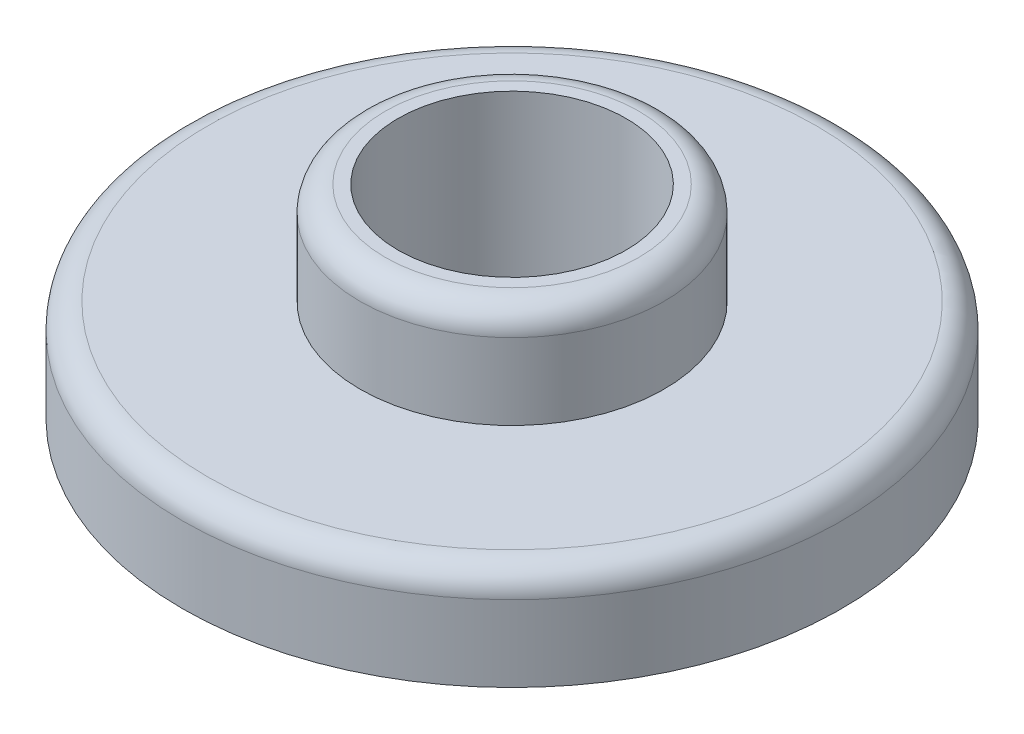
ISO-10303-21;
HEADER;
FILE_DESCRIPTION(('STEP AP214'),'2;1');
FILE_NAME('part.step','',(''),(''),'','','');
FILE_SCHEMA(('AUTOMOTIVE_DESIGN { 1 0 10303 214 1 1 1 1 }'));
ENDSEC;
DATA;
#1=APPLICATION_CONTEXT('core data for automotive mechanical design processes');
#2=APPLICATION_PROTOCOL_DEFINITION('international standard','automotive_design',2000,#1);
#3=PRODUCT_CONTEXT('',#1,'mechanical');
#4=PRODUCT('Part','Part','',(#3));
#5=PRODUCT_RELATED_PRODUCT_CATEGORY('part','',(#4));
#6=PRODUCT_DEFINITION_FORMATION('','',#4);
#7=PRODUCT_DEFINITION_CONTEXT('part definition',#1,'design');
#8=PRODUCT_DEFINITION('design','',#6,#7);
#9=PRODUCT_DEFINITION_SHAPE('','',#8);
#10=(LENGTH_UNIT() NAMED_UNIT(*) SI_UNIT(.MILLI.,.METRE.));
#11=(NAMED_UNIT(*) PLANE_ANGLE_UNIT() SI_UNIT($,.RADIAN.));
#12=(NAMED_UNIT(*) SI_UNIT($,.STERADIAN.) SOLID_ANGLE_UNIT());
#13=UNCERTAINTY_MEASURE_WITH_UNIT(LENGTH_MEASURE(1.E-05),#10,'distance_accuracy_value','');
#14=(GEOMETRIC_REPRESENTATION_CONTEXT(3) GLOBAL_UNCERTAINTY_ASSIGNED_CONTEXT((#13)) GLOBAL_UNIT_ASSIGNED_CONTEXT((#10,
#11,#12)) REPRESENTATION_CONTEXT('',''));
#15=CARTESIAN_POINT('',(0.,0.,0.));
#16=DIRECTION('',(0.,0.,1.));
#17=DIRECTION('',(1.,0.,0.));
#18=AXIS2_PLACEMENT_3D('',#15,#16,#17);
#19=CARTESIAN_POINT('',(0.,2.,0.));
#20=DIRECTION('',(0.,-1.,0.));
#21=DIRECTION('',(0.,0.,-1.));
#22=AXIS2_PLACEMENT_3D('',#19,#20,#21);
#23=CYLINDRICAL_SURFACE('',#22,6.5);
#24=CARTESIAN_POINT('',(0.,1.5,0.));
#25=DIRECTION('',(0.,1.,0.));
#26=DIRECTION('',(0.,0.,1.));
#27=AXIS2_PLACEMENT_3D('',#24,#25,#26);
#28=CIRCLE('',#27,6.5);
#29=CARTESIAN_POINT('',(0.,1.5,6.5));
#30=VERTEX_POINT('',#29);
#31=EDGE_CURVE('E10',#30,#30,#28,.F.);
#32=ORIENTED_EDGE('',*,*,#31,.T.);
#33=EDGE_LOOP('',(#32));
#34=FACE_BOUND('',#33,.T.);
#35=CARTESIAN_POINT('',(0.,0.,0.));
#36=DIRECTION('',(0.,1.,0.));
#37=DIRECTION('',(0.,0.,1.));
#38=AXIS2_PLACEMENT_3D('',#35,#36,#37);
#39=CIRCLE('',#38,6.5);
#40=CARTESIAN_POINT('',(0.,0.,6.5));
#41=VERTEX_POINT('',#40);
#42=EDGE_CURVE('E68',#41,#41,#39,.T.);
#43=ORIENTED_EDGE('',*,*,#42,.T.);
#44=EDGE_LOOP('',(#43));
#45=FACE_BOUND('',#44,.T.);
#46=ADVANCED_FACE('F43',(#34,#45),#23,.T.);
#47=CARTESIAN_POINT('',(0.,2.,0.));
#48=DIRECTION('',(0.,1.,0.));
#49=DIRECTION('',(0.,0.,1.));
#50=AXIS2_PLACEMENT_3D('',#47,#48,#49);
#51=PLANE('',#50);
#52=CARTESIAN_POINT('',(0.,2.,0.));
#53=DIRECTION('',(0.,1.,0.));
#54=DIRECTION('',(0.,0.,1.));
#55=AXIS2_PLACEMENT_3D('',#52,#53,#54);
#56=CIRCLE('',#55,6.);
#57=CARTESIAN_POINT('',(0.,2.,6.));
#58=VERTEX_POINT('',#57);
#59=EDGE_CURVE('E51',#58,#58,#56,.T.);
#60=ORIENTED_EDGE('',*,*,#59,.T.);
#61=EDGE_LOOP('',(#60));
#62=FACE_BOUND('',#61,.T.);
#63=CARTESIAN_POINT('',(0.,2.,0.));
#64=DIRECTION('',(0.,1.,0.));
#65=DIRECTION('',(0.,0.,1.));
#66=AXIS2_PLACEMENT_3D('',#63,#64,#65);
#67=CIRCLE('',#66,3.);
#68=CARTESIAN_POINT('',(0.,2.,3.));
#69=VERTEX_POINT('',#68);
#70=EDGE_CURVE('E67',#69,#69,#67,.T.);
#71=ORIENTED_EDGE('',*,*,#70,.F.);
#72=EDGE_LOOP('',(#71));
#73=FACE_BOUND('',#72,.T.);
#74=ADVANCED_FACE('F103',(#62,#73),#51,.T.);
#75=CARTESIAN_POINT('',(0.,0.,0.));
#76=DIRECTION('',(0.,1.,0.));
#77=DIRECTION('',(0.,0.,1.));
#78=AXIS2_PLACEMENT_3D('',#75,#76,#77);
#79=PLANE('',#78);
#80=CARTESIAN_POINT('',(0.,0.,0.));
#81=DIRECTION('',(0.,1.,0.));
#82=DIRECTION('',(0.,0.,1.));
#83=AXIS2_PLACEMENT_3D('',#80,#81,#82);
#84=CIRCLE('',#83,2.25);
#85=CARTESIAN_POINT('',(0.,0.,2.25));
#86=VERTEX_POINT('',#85);
#87=EDGE_CURVE('E72',#86,#86,#84,.T.);
#88=ORIENTED_EDGE('',*,*,#87,.T.);
#89=EDGE_LOOP('',(#88));
#90=FACE_BOUND('',#89,.T.);
#91=ORIENTED_EDGE('',*,*,#42,.F.);
#92=EDGE_LOOP('',(#91));
#93=FACE_BOUND('',#92,.T.);
#94=ADVANCED_FACE('F99',(#90,#93),#79,.F.);
#95=CARTESIAN_POINT('',(0.,4.,0.));
#96=DIRECTION('',(0.,-1.,0.));
#97=DIRECTION('',(0.,0.,-1.));
#98=AXIS2_PLACEMENT_3D('',#95,#96,#97);
#99=CYLINDRICAL_SURFACE('',#98,3.);
#100=CARTESIAN_POINT('',(0.,3.5,0.));
#101=DIRECTION('',(0.,1.,0.));
#102=DIRECTION('',(0.,0.,1.));
#103=AXIS2_PLACEMENT_3D('',#100,#101,#102);
#104=CIRCLE('',#103,3.);
#105=CARTESIAN_POINT('',(0.,3.5,3.));
#106=VERTEX_POINT('',#105);
#107=EDGE_CURVE('E56',#106,#106,#104,.F.);
#108=ORIENTED_EDGE('',*,*,#107,.T.);
#109=EDGE_LOOP('',(#108));
#110=FACE_BOUND('',#109,.T.);
#111=ORIENTED_EDGE('',*,*,#70,.T.);
#112=EDGE_LOOP('',(#111));
#113=FACE_BOUND('',#112,.T.);
#114=ADVANCED_FACE('F89',(#110,#113),#99,.T.);
#115=CARTESIAN_POINT('',(0.,4.,0.));
#116=DIRECTION('',(0.,1.,0.));
#117=DIRECTION('',(0.,0.,1.));
#118=AXIS2_PLACEMENT_3D('',#115,#116,#117);
#119=PLANE('',#118);
#120=CARTESIAN_POINT('',(0.,4.,0.));
#121=DIRECTION('',(0.,1.,0.));
#122=DIRECTION('',(0.,0.,1.));
#123=AXIS2_PLACEMENT_3D('',#120,#121,#122);
#124=CIRCLE('',#123,2.5);
#125=CARTESIAN_POINT('',(0.,4.,2.5));
#126=VERTEX_POINT('',#125);
#127=EDGE_CURVE('E61',#126,#126,#124,.T.);
#128=ORIENTED_EDGE('',*,*,#127,.T.);
#129=EDGE_LOOP('',(#128));
#130=FACE_BOUND('',#129,.T.);
#131=CARTESIAN_POINT('',(0.,4.,0.));
#132=DIRECTION('',(0.,1.,0.));
#133=DIRECTION('',(0.,0.,1.));
#134=AXIS2_PLACEMENT_3D('',#131,#132,#133);
#135=CIRCLE('',#134,2.25);
#136=CARTESIAN_POINT('',(0.,4.,2.25));
#137=VERTEX_POINT('',#136);
#138=EDGE_CURVE('E79',#137,#137,#135,.T.);
#139=ORIENTED_EDGE('',*,*,#138,.F.);
#140=EDGE_LOOP('',(#139));
#141=FACE_BOUND('',#140,.T.);
#142=ADVANCED_FACE('F87',(#130,#141),#119,.T.);
#143=CARTESIAN_POINT('',(0.,-6.,0.));
#144=DIRECTION('',(0.,1.,0.));
#145=DIRECTION('',(0.,0.,1.));
#146=AXIS2_PLACEMENT_3D('',#143,#144,#145);
#147=CYLINDRICAL_SURFACE('',#146,2.25);
#148=ORIENTED_EDGE('',*,*,#138,.T.);
#149=EDGE_LOOP('',(#148));
#150=FACE_BOUND('',#149,.T.);
#151=ORIENTED_EDGE('',*,*,#87,.F.);
#152=EDGE_LOOP('',(#151));
#153=FACE_BOUND('',#152,.T.);
#154=ADVANCED_FACE('F84',(#150,#153),#147,.F.);
#155=CARTESIAN_POINT('',(0.,3.5,0.));
#156=DIRECTION('',(0.,1.,0.));
#157=DIRECTION('',(0.,0.,1.));
#158=AXIS2_PLACEMENT_3D('',#155,#156,#157);
#159=TOROIDAL_SURFACE('',#158,2.5,0.5);
#160=ORIENTED_EDGE('',*,*,#107,.F.);
#161=EDGE_LOOP('',(#160));
#162=FACE_BOUND('',#161,.T.);
#163=ORIENTED_EDGE('',*,*,#127,.F.);
#164=EDGE_LOOP('',(#163));
#165=FACE_BOUND('',#164,.T.);
#166=ADVANCED_FACE('F97',(#162,#165),#159,.T.);
#167=CARTESIAN_POINT('',(0.,1.5,0.));
#168=DIRECTION('',(0.,1.,0.));
#169=DIRECTION('',(0.,0.,1.));
#170=AXIS2_PLACEMENT_3D('',#167,#168,#169);
#171=TOROIDAL_SURFACE('',#170,6.,0.5);
#172=ORIENTED_EDGE('',*,*,#31,.F.);
#173=EDGE_LOOP('',(#172));
#174=FACE_BOUND('',#173,.T.);
#175=ORIENTED_EDGE('',*,*,#59,.F.);
#176=EDGE_LOOP('',(#175));
#177=FACE_BOUND('',#176,.T.);
#178=ADVANCED_FACE('F45',(#174,#177),#171,.T.);
#179=CLOSED_SHELL('',(#46,#74,#94,#114,#142,#154,#166,#178));
#180=MANIFOLD_SOLID_BREP('B2',#179);
#181=ADVANCED_BREP_SHAPE_REPRESENTATION('',(#18,#180),#14);
#182=SHAPE_DEFINITION_REPRESENTATION(#9,#181);
ENDSEC;
END-ISO-10303-21;
